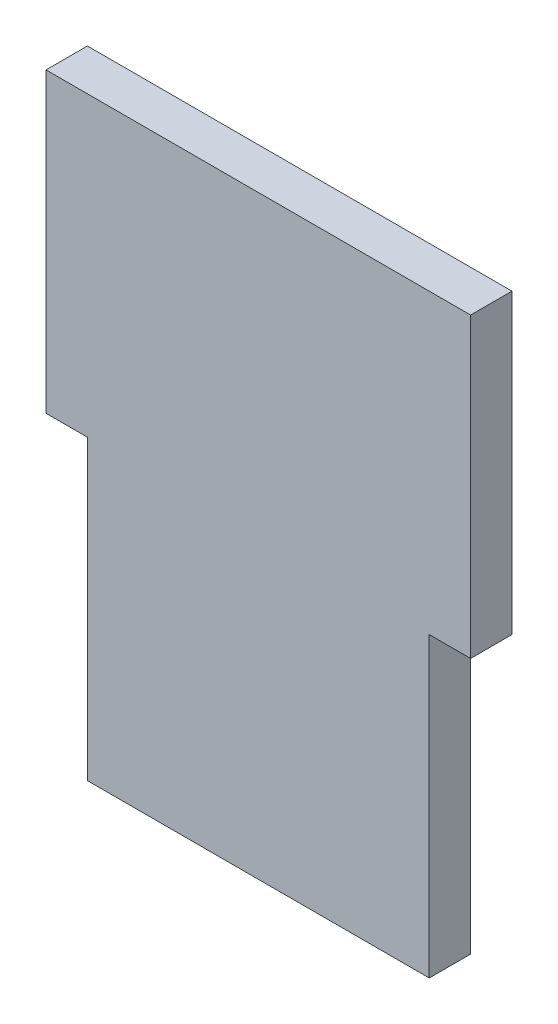
ISO-10303-21;
HEADER;
FILE_DESCRIPTION(('STEP AP214'),'2;1');
FILE_NAME('part.step','',(''),(''),'','','');
FILE_SCHEMA(('AUTOMOTIVE_DESIGN { 1 0 10303 214 1 1 1 1 }'));
ENDSEC;
DATA;
#1=APPLICATION_CONTEXT('core data for automotive mechanical design processes');
#2=APPLICATION_PROTOCOL_DEFINITION('international standard','automotive_design',2000,#1);
#3=PRODUCT_CONTEXT('',#1,'mechanical');
#4=PRODUCT('Part','Part','',(#3));
#5=PRODUCT_RELATED_PRODUCT_CATEGORY('part','',(#4));
#6=PRODUCT_DEFINITION_FORMATION('','',#4);
#7=PRODUCT_DEFINITION_CONTEXT('part definition',#1,'design');
#8=PRODUCT_DEFINITION('design','',#6,#7);
#9=PRODUCT_DEFINITION_SHAPE('','',#8);
#10=(LENGTH_UNIT() NAMED_UNIT(*) SI_UNIT(.MILLI.,.METRE.));
#11=(NAMED_UNIT(*) PLANE_ANGLE_UNIT() SI_UNIT($,.RADIAN.));
#12=(NAMED_UNIT(*) SI_UNIT($,.STERADIAN.) SOLID_ANGLE_UNIT());
#13=UNCERTAINTY_MEASURE_WITH_UNIT(LENGTH_MEASURE(1.E-05),#10,'distance_accuracy_value','');
#14=(GEOMETRIC_REPRESENTATION_CONTEXT(3) GLOBAL_UNCERTAINTY_ASSIGNED_CONTEXT((#13)) GLOBAL_UNIT_ASSIGNED_CONTEXT((#10,
#11,#12)) REPRESENTATION_CONTEXT('',''));
#15=CARTESIAN_POINT('',(0.,0.,0.));
#16=DIRECTION('',(0.,0.,1.));
#17=DIRECTION('',(1.,0.,0.));
#18=AXIS2_PLACEMENT_3D('',#15,#16,#17);
#19=CARTESIAN_POINT('',(-3.07339999999999,0.,3.0734));
#20=DIRECTION('',(1.,0.,0.));
#21=DIRECTION('',(0.,1.,0.));
#22=AXIS2_PLACEMENT_3D('',#19,#20,#21);
#23=PLANE('',#22);
#24=DIRECTION('',(0.,-1.,0.));
#25=VECTOR('',#24,1.);
#26=CARTESIAN_POINT('',(-3.07339999999999,0.,0.));
#27=LINE('',#26,#25);
#28=CARTESIAN_POINT('',(-3.0734,44.196,0.));
#29=VERTEX_POINT('',#28);
#30=CARTESIAN_POINT('',(-3.0734,22.098,0.));
#31=VERTEX_POINT('',#30);
#32=EDGE_CURVE('E131',#29,#31,#27,.T.);
#33=ORIENTED_EDGE('',*,*,#32,.T.);
#34=DIRECTION('',(0.,0.,-1.));
#35=VECTOR('',#34,1.);
#36=CARTESIAN_POINT('',(-3.0734,22.098,3.0734));
#37=LINE('',#36,#35);
#38=CARTESIAN_POINT('',(-3.0734,22.098,3.0734));
#39=VERTEX_POINT('',#38);
#40=EDGE_CURVE('E11',#39,#31,#37,.T.);
#41=ORIENTED_EDGE('',*,*,#40,.F.);
#42=DIRECTION('',(0.,-1.,0.));
#43=VECTOR('',#42,1.);
#44=CARTESIAN_POINT('',(-3.07339999999999,0.,3.0734));
#45=LINE('',#44,#43);
#46=CARTESIAN_POINT('',(-3.0734,44.196,3.0734));
#47=VERTEX_POINT('',#46);
#48=EDGE_CURVE('E147',#47,#39,#45,.T.);
#49=ORIENTED_EDGE('',*,*,#48,.F.);
#50=DIRECTION('',(0.,0.,-1.));
#51=VECTOR('',#50,1.);
#52=CARTESIAN_POINT('',(-3.0734,44.196,3.0734));
#53=LINE('',#52,#51);
#54=EDGE_CURVE('E127',#47,#29,#53,.T.);
#55=ORIENTED_EDGE('',*,*,#54,.T.);
#56=EDGE_LOOP('',(#33,#41,#49,#55));
#57=FACE_BOUND('',#56,.T.);
#58=ADVANCED_FACE('F35',(#57),#23,.F.);
#59=CARTESIAN_POINT('',(0.,22.098,3.0734));
#60=DIRECTION('',(0.,1.,0.));
#61=DIRECTION('',(0.,0.,1.));
#62=AXIS2_PLACEMENT_3D('',#59,#60,#61);
#63=PLANE('',#62);
#64=DIRECTION('',(1.,0.,0.));
#65=VECTOR('',#64,1.);
#66=CARTESIAN_POINT('',(0.,22.098,0.));
#67=LINE('',#66,#65);
#68=CARTESIAN_POINT('',(0.,22.098,0.));
#69=VERTEX_POINT('',#68);
#70=EDGE_CURVE('E134',#31,#69,#67,.T.);
#71=ORIENTED_EDGE('',*,*,#70,.T.);
#72=DIRECTION('',(0.,0.,-1.));
#73=VECTOR('',#72,1.);
#74=CARTESIAN_POINT('',(0.,22.098,3.0734));
#75=LINE('',#74,#73);
#76=CARTESIAN_POINT('',(0.,22.098,3.0734));
#77=VERTEX_POINT('',#76);
#78=EDGE_CURVE('E43',#77,#69,#75,.T.);
#79=ORIENTED_EDGE('',*,*,#78,.F.);
#80=DIRECTION('',(1.,0.,0.));
#81=VECTOR('',#80,1.);
#82=CARTESIAN_POINT('',(0.,22.098,3.0734));
#83=LINE('',#82,#81);
#84=EDGE_CURVE('E94',#39,#77,#83,.T.);
#85=ORIENTED_EDGE('',*,*,#84,.F.);
#86=ORIENTED_EDGE('',*,*,#40,.T.);
#87=EDGE_LOOP('',(#71,#79,#85,#86));
#88=FACE_BOUND('',#87,.T.);
#89=ADVANCED_FACE('F161',(#88),#63,.F.);
#90=CARTESIAN_POINT('',(0.,0.,3.0734));
#91=DIRECTION('',(-1.,0.,0.));
#92=DIRECTION('',(0.,0.,1.));
#93=AXIS2_PLACEMENT_3D('',#90,#91,#92);
#94=PLANE('',#93);
#95=DIRECTION('',(0.,1.,0.));
#96=VECTOR('',#95,1.);
#97=CARTESIAN_POINT('',(0.,0.,0.));
#98=LINE('',#97,#96);
#99=CARTESIAN_POINT('',(0.,0.,0.));
#100=VERTEX_POINT('',#99);
#101=EDGE_CURVE('E137',#100,#69,#98,.T.);
#102=ORIENTED_EDGE('',*,*,#101,.F.);
#103=DIRECTION('',(0.,0.,-1.));
#104=VECTOR('',#103,1.);
#105=CARTESIAN_POINT('',(0.,0.,3.0734));
#106=LINE('',#105,#104);
#107=CARTESIAN_POINT('',(0.,0.,3.0734));
#108=VERTEX_POINT('',#107);
#109=EDGE_CURVE('E154',#108,#100,#106,.T.);
#110=ORIENTED_EDGE('',*,*,#109,.F.);
#111=DIRECTION('',(0.,1.,0.));
#112=VECTOR('',#111,1.);
#113=CARTESIAN_POINT('',(0.,0.,3.0734));
#114=LINE('',#113,#112);
#115=EDGE_CURVE('E160',#108,#77,#114,.T.);
#116=ORIENTED_EDGE('',*,*,#115,.T.);
#117=ORIENTED_EDGE('',*,*,#78,.T.);
#118=EDGE_LOOP('',(#102,#110,#116,#117));
#119=FACE_BOUND('',#118,.T.);
#120=ADVANCED_FACE('F158',(#119),#94,.T.);
#121=CARTESIAN_POINT('',(0.,0.,3.0734));
#122=DIRECTION('',(0.,1.,0.));
#123=DIRECTION('',(0.,0.,1.));
#124=AXIS2_PLACEMENT_3D('',#121,#122,#123);
#125=PLANE('',#124);
#126=DIRECTION('',(1.,0.,0.));
#127=VECTOR('',#126,1.);
#128=CARTESIAN_POINT('',(0.,0.,0.));
#129=LINE('',#128,#127);
#130=CARTESIAN_POINT('',(25.4,0.,0.));
#131=VERTEX_POINT('',#130);
#132=EDGE_CURVE('E140',#100,#131,#129,.T.);
#133=ORIENTED_EDGE('',*,*,#132,.T.);
#134=DIRECTION('',(0.,0.,-1.));
#135=VECTOR('',#134,1.);
#136=CARTESIAN_POINT('',(25.4,0.,3.0734));
#137=LINE('',#136,#135);
#138=CARTESIAN_POINT('',(25.4,0.,3.0734));
#139=VERTEX_POINT('',#138);
#140=EDGE_CURVE('E151',#139,#131,#137,.T.);
#141=ORIENTED_EDGE('',*,*,#140,.F.);
#142=DIRECTION('',(1.,0.,0.));
#143=VECTOR('',#142,1.);
#144=CARTESIAN_POINT('',(0.,0.,3.0734));
#145=LINE('',#144,#143);
#146=EDGE_CURVE('E174',#108,#139,#145,.T.);
#147=ORIENTED_EDGE('',*,*,#146,.F.);
#148=ORIENTED_EDGE('',*,*,#109,.T.);
#149=EDGE_LOOP('',(#133,#141,#147,#148));
#150=FACE_BOUND('',#149,.T.);
#151=ADVANCED_FACE('F170',(#150),#125,.F.);
#152=CARTESIAN_POINT('',(25.4,0.,3.0734));
#153=DIRECTION('',(-1.,0.,0.));
#154=DIRECTION('',(0.,-1.,0.));
#155=AXIS2_PLACEMENT_3D('',#152,#153,#154);
#156=PLANE('',#155);
#157=DIRECTION('',(0.,1.,0.));
#158=VECTOR('',#157,1.);
#159=CARTESIAN_POINT('',(25.4,0.,0.));
#160=LINE('',#159,#158);
#161=CARTESIAN_POINT('',(25.4,22.098,0.));
#162=VERTEX_POINT('',#161);
#163=EDGE_CURVE('E142',#131,#162,#160,.T.);
#164=ORIENTED_EDGE('',*,*,#163,.T.);
#165=DIRECTION('',(0.,0.,-1.));
#166=VECTOR('',#165,1.);
#167=CARTESIAN_POINT('',(25.4,22.098,3.0734));
#168=LINE('',#167,#166);
#169=CARTESIAN_POINT('',(25.4,22.098,3.0734));
#170=VERTEX_POINT('',#169);
#171=EDGE_CURVE('E122',#170,#162,#168,.T.);
#172=ORIENTED_EDGE('',*,*,#171,.F.);
#173=DIRECTION('',(0.,1.,0.));
#174=VECTOR('',#173,1.);
#175=CARTESIAN_POINT('',(25.4,0.,3.0734));
#176=LINE('',#175,#174);
#177=EDGE_CURVE('E113',#139,#170,#176,.T.);
#178=ORIENTED_EDGE('',*,*,#177,.F.);
#179=ORIENTED_EDGE('',*,*,#140,.T.);
#180=EDGE_LOOP('',(#164,#172,#178,#179));
#181=FACE_BOUND('',#180,.T.);
#182=ADVANCED_FACE('F173',(#181),#156,.F.);
#183=CARTESIAN_POINT('',(0.,22.098,3.0734));
#184=DIRECTION('',(0.,1.,0.));
#185=DIRECTION('',(0.,0.,1.));
#186=AXIS2_PLACEMENT_3D('',#183,#184,#185);
#187=PLANE('',#186);
#188=DIRECTION('',(1.,0.,0.));
#189=VECTOR('',#188,1.);
#190=CARTESIAN_POINT('',(0.,22.098,0.));
#191=LINE('',#190,#189);
#192=CARTESIAN_POINT('',(28.4734,22.098,0.));
#193=VERTEX_POINT('',#192);
#194=EDGE_CURVE('E121',#162,#193,#191,.T.);
#195=ORIENTED_EDGE('',*,*,#194,.T.);
#196=DIRECTION('',(0.,0.,-1.));
#197=VECTOR('',#196,1.);
#198=CARTESIAN_POINT('',(28.4734,22.098,3.0734));
#199=LINE('',#198,#197);
#200=CARTESIAN_POINT('',(28.4734,22.098,3.0734));
#201=VERTEX_POINT('',#200);
#202=EDGE_CURVE('E118',#201,#193,#199,.T.);
#203=ORIENTED_EDGE('',*,*,#202,.F.);
#204=DIRECTION('',(1.,0.,0.));
#205=VECTOR('',#204,1.);
#206=CARTESIAN_POINT('',(0.,22.098,3.0734));
#207=LINE('',#206,#205);
#208=EDGE_CURVE('E107',#170,#201,#207,.T.);
#209=ORIENTED_EDGE('',*,*,#208,.F.);
#210=ORIENTED_EDGE('',*,*,#171,.T.);
#211=EDGE_LOOP('',(#195,#203,#209,#210));
#212=FACE_BOUND('',#211,.T.);
#213=ADVANCED_FACE('F119',(#212),#187,.F.);
#214=CARTESIAN_POINT('',(28.4734,0.,3.0734));
#215=DIRECTION('',(-1.,0.,0.));
#216=DIRECTION('',(0.,-1.,0.));
#217=AXIS2_PLACEMENT_3D('',#214,#215,#216);
#218=PLANE('',#217);
#219=DIRECTION('',(0.,1.,0.));
#220=VECTOR('',#219,1.);
#221=CARTESIAN_POINT('',(28.4734,0.,0.));
#222=LINE('',#221,#220);
#223=CARTESIAN_POINT('',(28.4734,44.196,0.));
#224=VERTEX_POINT('',#223);
#225=EDGE_CURVE('E80',#193,#224,#222,.T.);
#226=ORIENTED_EDGE('',*,*,#225,.T.);
#227=DIRECTION('',(0.,0.,-1.));
#228=VECTOR('',#227,1.);
#229=CARTESIAN_POINT('',(28.4734,44.196,3.0734));
#230=LINE('',#229,#228);
#231=CARTESIAN_POINT('',(28.4734,44.196,3.0734));
#232=VERTEX_POINT('',#231);
#233=EDGE_CURVE('E123',#232,#224,#230,.T.);
#234=ORIENTED_EDGE('',*,*,#233,.F.);
#235=DIRECTION('',(0.,1.,0.));
#236=VECTOR('',#235,1.);
#237=CARTESIAN_POINT('',(28.4734,0.,3.0734));
#238=LINE('',#237,#236);
#239=EDGE_CURVE('E111',#201,#232,#238,.T.);
#240=ORIENTED_EDGE('',*,*,#239,.F.);
#241=ORIENTED_EDGE('',*,*,#202,.T.);
#242=EDGE_LOOP('',(#226,#234,#240,#241));
#243=FACE_BOUND('',#242,.T.);
#244=ADVANCED_FACE('F125',(#243),#218,.F.);
#245=CARTESIAN_POINT('',(0.,44.196,3.0734));
#246=DIRECTION('',(0.,-1.,0.));
#247=DIRECTION('',(0.,0.,-1.));
#248=AXIS2_PLACEMENT_3D('',#245,#246,#247);
#249=PLANE('',#248);
#250=DIRECTION('',(-1.,0.,0.));
#251=VECTOR('',#250,1.);
#252=CARTESIAN_POINT('',(0.,44.196,0.));
#253=LINE('',#252,#251);
#254=EDGE_CURVE('E86',#224,#29,#253,.T.);
#255=ORIENTED_EDGE('',*,*,#254,.T.);
#256=ORIENTED_EDGE('',*,*,#54,.F.);
#257=DIRECTION('',(-1.,0.,0.));
#258=VECTOR('',#257,1.);
#259=CARTESIAN_POINT('',(0.,44.196,3.0734));
#260=LINE('',#259,#258);
#261=EDGE_CURVE('E51',#232,#47,#260,.T.);
#262=ORIENTED_EDGE('',*,*,#261,.F.);
#263=ORIENTED_EDGE('',*,*,#233,.T.);
#264=EDGE_LOOP('',(#255,#256,#262,#263));
#265=FACE_BOUND('',#264,.T.);
#266=ADVANCED_FACE('F181',(#265),#249,.F.);
#267=CARTESIAN_POINT('',(0.,0.,3.0734));
#268=DIRECTION('',(0.,0.,1.));
#269=DIRECTION('',(1.,0.,0.));
#270=AXIS2_PLACEMENT_3D('',#267,#268,#269);
#271=PLANE('',#270);
#272=ORIENTED_EDGE('',*,*,#48,.T.);
#273=ORIENTED_EDGE('',*,*,#84,.T.);
#274=ORIENTED_EDGE('',*,*,#115,.F.);
#275=ORIENTED_EDGE('',*,*,#146,.T.);
#276=ORIENTED_EDGE('',*,*,#177,.T.);
#277=ORIENTED_EDGE('',*,*,#208,.T.);
#278=ORIENTED_EDGE('',*,*,#239,.T.);
#279=ORIENTED_EDGE('',*,*,#261,.T.);
#280=EDGE_LOOP('',(#272,#273,#274,#275,#276,#277,#278,#279));
#281=FACE_BOUND('',#280,.T.);
#282=ADVANCED_FACE('F109',(#281),#271,.T.);
#283=CARTESIAN_POINT('',(0.,0.,0.));
#284=DIRECTION('',(0.,0.,1.));
#285=DIRECTION('',(1.,0.,0.));
#286=AXIS2_PLACEMENT_3D('',#283,#284,#285);
#287=PLANE('',#286);
#288=ORIENTED_EDGE('',*,*,#32,.F.);
#289=ORIENTED_EDGE('',*,*,#254,.F.);
#290=ORIENTED_EDGE('',*,*,#225,.F.);
#291=ORIENTED_EDGE('',*,*,#194,.F.);
#292=ORIENTED_EDGE('',*,*,#163,.F.);
#293=ORIENTED_EDGE('',*,*,#132,.F.);
#294=ORIENTED_EDGE('',*,*,#101,.T.);
#295=ORIENTED_EDGE('',*,*,#70,.F.);
#296=EDGE_LOOP('',(#288,#289,#290,#291,#292,#293,#294,#295));
#297=FACE_BOUND('',#296,.T.);
#298=ADVANCED_FACE('F166',(#297),#287,.F.);
#299=CLOSED_SHELL('',(#58,#89,#120,#151,#182,#213,#244,#266,#282,#298));
#300=MANIFOLD_SOLID_BREP('B2',#299);
#301=ADVANCED_BREP_SHAPE_REPRESENTATION('',(#18,#300),#14);
#302=SHAPE_DEFINITION_REPRESENTATION(#9,#301);
ENDSEC;
END-ISO-10303-21;
